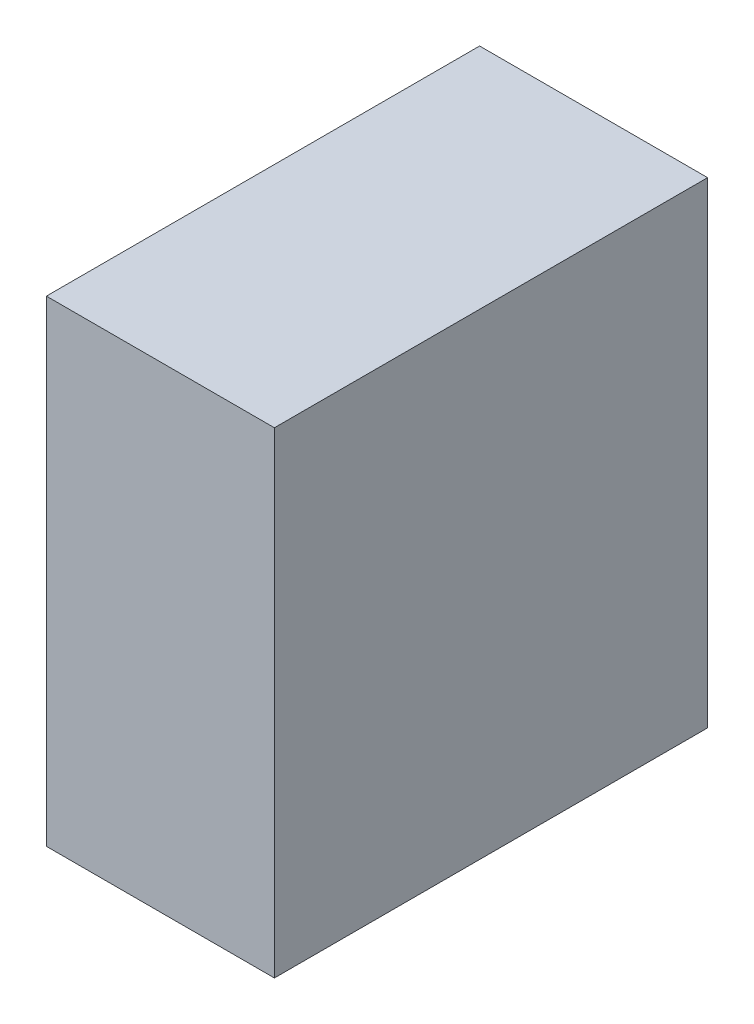
ISO-10303-21;
HEADER;
FILE_DESCRIPTION(('STEP AP214'),'2;1');
FILE_NAME('part.step','',(''),(''),'','','');
FILE_SCHEMA(('AUTOMOTIVE_DESIGN { 1 0 10303 214 1 1 1 1 }'));
ENDSEC;
DATA;
#1=APPLICATION_CONTEXT('core data for automotive mechanical design processes');
#2=APPLICATION_PROTOCOL_DEFINITION('international standard','automotive_design',2000,#1);
#3=PRODUCT_CONTEXT('',#1,'mechanical');
#4=PRODUCT('Part','Part','',(#3));
#5=PRODUCT_RELATED_PRODUCT_CATEGORY('part','',(#4));
#6=PRODUCT_DEFINITION_FORMATION('','',#4);
#7=PRODUCT_DEFINITION_CONTEXT('part definition',#1,'design');
#8=PRODUCT_DEFINITION('design','',#6,#7);
#9=PRODUCT_DEFINITION_SHAPE('','',#8);
#10=(LENGTH_UNIT() NAMED_UNIT(*) SI_UNIT(.MILLI.,.METRE.));
#11=(NAMED_UNIT(*) PLANE_ANGLE_UNIT() SI_UNIT($,.RADIAN.));
#12=(NAMED_UNIT(*) SI_UNIT($,.STERADIAN.) SOLID_ANGLE_UNIT());
#13=UNCERTAINTY_MEASURE_WITH_UNIT(LENGTH_MEASURE(1.E-05),#10,'distance_accuracy_value','');
#14=(GEOMETRIC_REPRESENTATION_CONTEXT(3) GLOBAL_UNCERTAINTY_ASSIGNED_CONTEXT((#13)) GLOBAL_UNIT_ASSIGNED_CONTEXT((#10,
#11,#12)) REPRESENTATION_CONTEXT('',''));
#15=CARTESIAN_POINT('',(0.,0.,0.));
#16=DIRECTION('',(0.,0.,1.));
#17=DIRECTION('',(1.,0.,0.));
#18=AXIS2_PLACEMENT_3D('',#15,#16,#17);
#19=CARTESIAN_POINT('',(150.,1044.,-790.));
#20=DIRECTION('',(-1.,0.,0.));
#21=DIRECTION('',(0.,0.,1.));
#22=AXIS2_PLACEMENT_3D('',#19,#20,#21);
#23=PLANE('',#22);
#24=DIRECTION('',(0.,-1.,0.));
#25=VECTOR('',#24,1.);
#26=CARTESIAN_POINT('',(150.,1044.,-30.));
#27=LINE('',#26,#25);
#28=CARTESIAN_POINT('',(150.,1880.,-30.));
#29=VERTEX_POINT('',#28);
#30=CARTESIAN_POINT('',(150.,1044.,-30.));
#31=VERTEX_POINT('',#30);
#32=EDGE_CURVE('E103',#29,#31,#27,.T.);
#33=ORIENTED_EDGE('',*,*,#32,.F.);
#34=DIRECTION('',(0.,0.,1.));
#35=VECTOR('',#34,1.);
#36=CARTESIAN_POINT('',(150.,1880.,-790.));
#37=LINE('',#36,#35);
#38=CARTESIAN_POINT('',(150.,1880.,-790.));
#39=VERTEX_POINT('',#38);
#40=EDGE_CURVE('E11',#39,#29,#37,.T.);
#41=ORIENTED_EDGE('',*,*,#40,.F.);
#42=DIRECTION('',(0.,-1.,0.));
#43=VECTOR('',#42,1.);
#44=CARTESIAN_POINT('',(150.,1044.,-790.));
#45=LINE('',#44,#43);
#46=CARTESIAN_POINT('',(150.,1044.,-790.));
#47=VERTEX_POINT('',#46);
#48=EDGE_CURVE('E97',#39,#47,#45,.T.);
#49=ORIENTED_EDGE('',*,*,#48,.T.);
#50=DIRECTION('',(0.,0.,1.));
#51=VECTOR('',#50,1.);
#52=CARTESIAN_POINT('',(150.,1044.,-790.));
#53=LINE('',#52,#51);
#54=EDGE_CURVE('E42',#47,#31,#53,.T.);
#55=ORIENTED_EDGE('',*,*,#54,.T.);
#56=EDGE_LOOP('',(#33,#41,#49,#55));
#57=FACE_BOUND('',#56,.T.);
#58=ADVANCED_FACE('F39',(#57),#23,.T.);
#59=CARTESIAN_POINT('',(150.,1880.,-790.));
#60=DIRECTION('',(0.,1.,0.));
#61=DIRECTION('',(0.,0.,1.));
#62=AXIS2_PLACEMENT_3D('',#59,#60,#61);
#63=PLANE('',#62);
#64=DIRECTION('',(-1.,0.,0.));
#65=VECTOR('',#64,1.);
#66=CARTESIAN_POINT('',(150.,1880.,-30.));
#67=LINE('',#66,#65);
#68=CARTESIAN_POINT('',(550.,1880.,-30.));
#69=VERTEX_POINT('',#68);
#70=EDGE_CURVE('E99',#69,#29,#67,.T.);
#71=ORIENTED_EDGE('',*,*,#70,.F.);
#72=DIRECTION('',(0.,0.,1.));
#73=VECTOR('',#72,1.);
#74=CARTESIAN_POINT('',(550.,1880.,-790.));
#75=LINE('',#74,#73);
#76=CARTESIAN_POINT('',(550.,1880.,-790.));
#77=VERTEX_POINT('',#76);
#78=EDGE_CURVE('E48',#77,#69,#75,.T.);
#79=ORIENTED_EDGE('',*,*,#78,.F.);
#80=DIRECTION('',(-1.,0.,0.));
#81=VECTOR('',#80,1.);
#82=CARTESIAN_POINT('',(150.,1880.,-790.));
#83=LINE('',#82,#81);
#84=EDGE_CURVE('E94',#77,#39,#83,.T.);
#85=ORIENTED_EDGE('',*,*,#84,.T.);
#86=ORIENTED_EDGE('',*,*,#40,.T.);
#87=EDGE_LOOP('',(#71,#79,#85,#86));
#88=FACE_BOUND('',#87,.T.);
#89=ADVANCED_FACE('F113',(#88),#63,.T.);
#90=CARTESIAN_POINT('',(550.,1044.,-790.));
#91=DIRECTION('',(1.,0.,0.));
#92=DIRECTION('',(0.,0.,-1.));
#93=AXIS2_PLACEMENT_3D('',#90,#91,#92);
#94=PLANE('',#93);
#95=DIRECTION('',(0.,1.,0.));
#96=VECTOR('',#95,1.);
#97=CARTESIAN_POINT('',(550.,1044.,-30.));
#98=LINE('',#97,#96);
#99=CARTESIAN_POINT('',(550.,1044.,-30.));
#100=VERTEX_POINT('',#99);
#101=EDGE_CURVE('E89',#100,#69,#98,.T.);
#102=ORIENTED_EDGE('',*,*,#101,.F.);
#103=DIRECTION('',(0.,0.,1.));
#104=VECTOR('',#103,1.);
#105=CARTESIAN_POINT('',(550.,1044.,-790.));
#106=LINE('',#105,#104);
#107=CARTESIAN_POINT('',(550.,1044.,-790.));
#108=VERTEX_POINT('',#107);
#109=EDGE_CURVE('E84',#108,#100,#106,.T.);
#110=ORIENTED_EDGE('',*,*,#109,.F.);
#111=DIRECTION('',(0.,1.,0.));
#112=VECTOR('',#111,1.);
#113=CARTESIAN_POINT('',(550.,1044.,-790.));
#114=LINE('',#113,#112);
#115=EDGE_CURVE('E87',#108,#77,#114,.T.);
#116=ORIENTED_EDGE('',*,*,#115,.T.);
#117=ORIENTED_EDGE('',*,*,#78,.T.);
#118=EDGE_LOOP('',(#102,#110,#116,#117));
#119=FACE_BOUND('',#118,.T.);
#120=ADVANCED_FACE('F86',(#119),#94,.T.);
#121=CARTESIAN_POINT('',(150.,1044.,-790.));
#122=DIRECTION('',(0.,-1.,0.));
#123=DIRECTION('',(0.,0.,-1.));
#124=AXIS2_PLACEMENT_3D('',#121,#122,#123);
#125=PLANE('',#124);
#126=DIRECTION('',(1.,0.,0.));
#127=VECTOR('',#126,1.);
#128=CARTESIAN_POINT('',(150.,1044.,-30.));
#129=LINE('',#128,#127);
#130=EDGE_CURVE('E106',#31,#100,#129,.T.);
#131=ORIENTED_EDGE('',*,*,#130,.F.);
#132=ORIENTED_EDGE('',*,*,#54,.F.);
#133=DIRECTION('',(1.,0.,0.));
#134=VECTOR('',#133,1.);
#135=CARTESIAN_POINT('',(150.,1044.,-790.));
#136=LINE('',#135,#134);
#137=EDGE_CURVE('E93',#47,#108,#136,.T.);
#138=ORIENTED_EDGE('',*,*,#137,.T.);
#139=ORIENTED_EDGE('',*,*,#109,.T.);
#140=EDGE_LOOP('',(#131,#132,#138,#139));
#141=FACE_BOUND('',#140,.T.);
#142=ADVANCED_FACE('F96',(#141),#125,.T.);
#143=CARTESIAN_POINT('',(0.,0.,-790.));
#144=DIRECTION('',(0.,0.,-1.));
#145=DIRECTION('',(-1.,0.,0.));
#146=AXIS2_PLACEMENT_3D('',#143,#144,#145);
#147=PLANE('',#146);
#148=ORIENTED_EDGE('',*,*,#48,.F.);
#149=ORIENTED_EDGE('',*,*,#84,.F.);
#150=ORIENTED_EDGE('',*,*,#115,.F.);
#151=ORIENTED_EDGE('',*,*,#137,.F.);
#152=EDGE_LOOP('',(#148,#149,#150,#151));
#153=FACE_BOUND('',#152,.T.);
#154=ADVANCED_FACE('F92',(#153),#147,.T.);
#155=CARTESIAN_POINT('',(0.,0.,-30.));
#156=DIRECTION('',(0.,0.,-1.));
#157=DIRECTION('',(-1.,0.,0.));
#158=AXIS2_PLACEMENT_3D('',#155,#156,#157);
#159=PLANE('',#158);
#160=ORIENTED_EDGE('',*,*,#32,.T.);
#161=ORIENTED_EDGE('',*,*,#130,.T.);
#162=ORIENTED_EDGE('',*,*,#101,.T.);
#163=ORIENTED_EDGE('',*,*,#70,.T.);
#164=EDGE_LOOP('',(#160,#161,#162,#163));
#165=FACE_BOUND('',#164,.T.);
#166=ADVANCED_FACE('F112',(#165),#159,.F.);
#167=CLOSED_SHELL('',(#58,#89,#120,#142,#154,#166));
#168=MANIFOLD_SOLID_BREP('B2',#167);
#169=ADVANCED_BREP_SHAPE_REPRESENTATION('',(#18,#168),#14);
#170=SHAPE_DEFINITION_REPRESENTATION(#9,#169);
ENDSEC;
END-ISO-10303-21;
